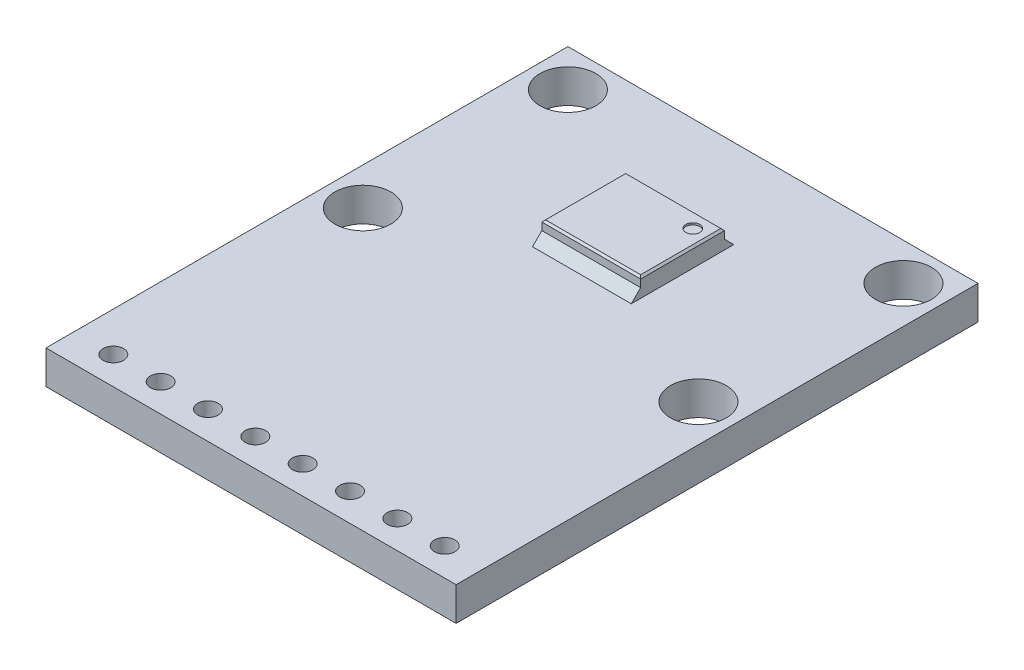
ISO-10303-21;
HEADER;
FILE_DESCRIPTION(('STEP AP214'),'2;1');
FILE_NAME('part.step','',(''),(''),'','','');
FILE_SCHEMA(('AUTOMOTIVE_DESIGN { 1 0 10303 214 1 1 1 1 }'));
ENDSEC;
DATA;
#1=APPLICATION_CONTEXT('core data for automotive mechanical design processes');
#2=APPLICATION_PROTOCOL_DEFINITION('international standard','automotive_design',2000,#1);
#3=PRODUCT_CONTEXT('',#1,'mechanical');
#4=PRODUCT('Part','Part','',(#3));
#5=PRODUCT_RELATED_PRODUCT_CATEGORY('part','',(#4));
#6=PRODUCT_DEFINITION_FORMATION('','',#4);
#7=PRODUCT_DEFINITION_CONTEXT('part definition',#1,'design');
#8=PRODUCT_DEFINITION('design','',#6,#7);
#9=PRODUCT_DEFINITION_SHAPE('','',#8);
#10=(LENGTH_UNIT() NAMED_UNIT(*) SI_UNIT(.MILLI.,.METRE.));
#11=(NAMED_UNIT(*) PLANE_ANGLE_UNIT() SI_UNIT($,.RADIAN.));
#12=(NAMED_UNIT(*) SI_UNIT($,.STERADIAN.) SOLID_ANGLE_UNIT());
#13=UNCERTAINTY_MEASURE_WITH_UNIT(LENGTH_MEASURE(1.E-05),#10,'distance_accuracy_value','');
#14=(GEOMETRIC_REPRESENTATION_CONTEXT(3) GLOBAL_UNCERTAINTY_ASSIGNED_CONTEXT((#13)) GLOBAL_UNIT_ASSIGNED_CONTEXT((#10,
#11,#12)) REPRESENTATION_CONTEXT('',''));
#15=CARTESIAN_POINT('',(0.,0.,0.));
#16=DIRECTION('',(0.,0.,1.));
#17=DIRECTION('',(1.,0.,0.));
#18=AXIS2_PLACEMENT_3D('',#15,#16,#17);
#19=CARTESIAN_POINT('',(0.,1.8,0.));
#20=DIRECTION('',(0.,1.,0.));
#21=DIRECTION('',(0.,0.,1.));
#22=AXIS2_PLACEMENT_3D('',#19,#20,#21);
#23=PLANE('',#22);
#24=CARTESIAN_POINT('',(6.35,1.8,12.5));
#25=DIRECTION('',(0.,1.,0.));
#26=DIRECTION('',(0.,0.,1.));
#27=AXIS2_PLACEMENT_3D('',#24,#25,#26);
#28=CIRCLE('',#27,0.55);
#29=CARTESIAN_POINT('',(6.35,1.8,13.05));
#30=VERTEX_POINT('',#29);
#31=EDGE_CURVE('E269',#30,#30,#28,.T.);
#32=ORIENTED_EDGE('',*,*,#31,.F.);
#33=EDGE_LOOP('',(#32));
#34=FACE_BOUND('',#33,.T.);
#35=CARTESIAN_POINT('',(1.27,1.8,12.5));
#36=DIRECTION('',(0.,1.,0.));
#37=DIRECTION('',(0.,0.,1.));
#38=AXIS2_PLACEMENT_3D('',#35,#36,#37);
#39=CIRCLE('',#38,0.55);
#40=CARTESIAN_POINT('',(1.27,1.8,13.05));
#41=VERTEX_POINT('',#40);
#42=EDGE_CURVE('E285',#41,#41,#39,.T.);
#43=ORIENTED_EDGE('',*,*,#42,.F.);
#44=EDGE_LOOP('',(#43));
#45=FACE_BOUND('',#44,.T.);
#46=CARTESIAN_POINT('',(-3.81,1.8,12.5));
#47=DIRECTION('',(0.,1.,0.));
#48=DIRECTION('',(0.,0.,1.));
#49=AXIS2_PLACEMENT_3D('',#46,#47,#48);
#50=CIRCLE('',#49,0.55);
#51=CARTESIAN_POINT('',(-3.81,1.8,13.05));
#52=VERTEX_POINT('',#51);
#53=EDGE_CURVE('E301',#52,#52,#50,.T.);
#54=ORIENTED_EDGE('',*,*,#53,.F.);
#55=EDGE_LOOP('',(#54));
#56=FACE_BOUND('',#55,.T.);
#57=CARTESIAN_POINT('',(-8.89,1.8,12.5));
#58=DIRECTION('',(0.,1.,0.));
#59=DIRECTION('',(0.,0.,1.));
#60=AXIS2_PLACEMENT_3D('',#57,#58,#59);
#61=CIRCLE('',#60,0.55);
#62=CARTESIAN_POINT('',(-8.89,1.8,13.05));
#63=VERTEX_POINT('',#62);
#64=EDGE_CURVE('E317',#63,#63,#61,.T.);
#65=ORIENTED_EDGE('',*,*,#64,.F.);
#66=EDGE_LOOP('',(#65));
#67=FACE_BOUND('',#66,.T.);
#68=CARTESIAN_POINT('',(9.,1.8,-1.));
#69=DIRECTION('',(0.,1.,0.));
#70=DIRECTION('',(0.,0.,1.));
#71=AXIS2_PLACEMENT_3D('',#68,#69,#70);
#72=CIRCLE('',#71,1.5);
#73=CARTESIAN_POINT('',(9.,1.8,0.5));
#74=VERTEX_POINT('',#73);
#75=EDGE_CURVE('E333',#74,#74,#72,.T.);
#76=ORIENTED_EDGE('',*,*,#75,.F.);
#77=EDGE_LOOP('',(#76));
#78=FACE_BOUND('',#77,.T.);
#79=CARTESIAN_POINT('',(-9.,1.8,-12.));
#80=DIRECTION('',(0.,1.,0.));
#81=DIRECTION('',(0.,0.,1.));
#82=AXIS2_PLACEMENT_3D('',#79,#80,#81);
#83=CIRCLE('',#82,1.5);
#84=CARTESIAN_POINT('',(-9.,1.8,-10.5));
#85=VERTEX_POINT('',#84);
#86=EDGE_CURVE('E349',#85,#85,#83,.T.);
#87=ORIENTED_EDGE('',*,*,#86,.F.);
#88=EDGE_LOOP('',(#87));
#89=FACE_BOUND('',#88,.T.);
#90=DIRECTION('',(0.,0.,-1.));
#91=VECTOR('',#90,1.);
#92=CARTESIAN_POINT('',(11.,1.8,-14.));
#93=LINE('',#92,#91);
#94=CARTESIAN_POINT('',(11.,1.8,14.));
#95=VERTEX_POINT('',#94);
#96=CARTESIAN_POINT('',(11.,1.8,-14.));
#97=VERTEX_POINT('',#96);
#98=EDGE_CURVE('E144',#95,#97,#93,.T.);
#99=ORIENTED_EDGE('',*,*,#98,.T.);
#100=DIRECTION('',(-1.,0.,0.));
#101=VECTOR('',#100,1.);
#102=CARTESIAN_POINT('',(-11.,1.8,-14.));
#103=LINE('',#102,#101);
#104=CARTESIAN_POINT('',(-11.,1.8,-14.));
#105=VERTEX_POINT('',#104);
#106=EDGE_CURVE('E132',#97,#105,#103,.T.);
#107=ORIENTED_EDGE('',*,*,#106,.T.);
#108=DIRECTION('',(0.,0.,1.));
#109=VECTOR('',#108,1.);
#110=CARTESIAN_POINT('',(-11.,1.8,-14.));
#111=LINE('',#110,#109);
#112=CARTESIAN_POINT('',(-11.,1.8,14.));
#113=VERTEX_POINT('',#112);
#114=EDGE_CURVE('E143',#105,#113,#111,.T.);
#115=ORIENTED_EDGE('',*,*,#114,.T.);
#116=DIRECTION('',(1.,0.,0.));
#117=VECTOR('',#116,1.);
#118=CARTESIAN_POINT('',(-11.,1.8,14.));
#119=LINE('',#118,#117);
#120=EDGE_CURVE('E149',#113,#95,#119,.T.);
#121=ORIENTED_EDGE('',*,*,#120,.T.);
#122=EDGE_LOOP('',(#99,#107,#115,#121));
#123=FACE_BOUND('',#122,.T.);
#124=CARTESIAN_POINT('',(9.,1.8,-12.));
#125=DIRECTION('',(0.,1.,0.));
#126=DIRECTION('',(0.,0.,1.));
#127=AXIS2_PLACEMENT_3D('',#124,#125,#126);
#128=CIRCLE('',#127,1.5);
#129=CARTESIAN_POINT('',(9.,1.8,-10.5));
#130=VERTEX_POINT('',#129);
#131=EDGE_CURVE('E341',#130,#130,#128,.T.);
#132=ORIENTED_EDGE('',*,*,#131,.F.);
#133=EDGE_LOOP('',(#132));
#134=FACE_BOUND('',#133,.T.);
#135=CARTESIAN_POINT('',(-9.,1.8,-1.));
#136=DIRECTION('',(0.,1.,0.));
#137=DIRECTION('',(0.,0.,1.));
#138=AXIS2_PLACEMENT_3D('',#135,#136,#137);
#139=CIRCLE('',#138,1.5);
#140=CARTESIAN_POINT('',(-9.,1.8,0.499999999999997));
#141=VERTEX_POINT('',#140);
#142=EDGE_CURVE('E325',#141,#141,#139,.T.);
#143=ORIENTED_EDGE('',*,*,#142,.F.);
#144=EDGE_LOOP('',(#143));
#145=FACE_BOUND('',#144,.T.);
#146=CARTESIAN_POINT('',(-6.35,1.8,12.5));
#147=DIRECTION('',(0.,1.,0.));
#148=DIRECTION('',(0.,0.,1.));
#149=AXIS2_PLACEMENT_3D('',#146,#147,#148);
#150=CIRCLE('',#149,0.55);
#151=CARTESIAN_POINT('',(-6.35,1.8,13.05));
#152=VERTEX_POINT('',#151);
#153=EDGE_CURVE('E309',#152,#152,#150,.T.);
#154=ORIENTED_EDGE('',*,*,#153,.F.);
#155=EDGE_LOOP('',(#154));
#156=FACE_BOUND('',#155,.T.);
#157=CARTESIAN_POINT('',(-1.27,1.8,12.5));
#158=DIRECTION('',(0.,1.,0.));
#159=DIRECTION('',(0.,0.,1.));
#160=AXIS2_PLACEMENT_3D('',#157,#158,#159);
#161=CIRCLE('',#160,0.55);
#162=CARTESIAN_POINT('',(-1.27,1.8,13.05));
#163=VERTEX_POINT('',#162);
#164=EDGE_CURVE('E293',#163,#163,#161,.T.);
#165=ORIENTED_EDGE('',*,*,#164,.F.);
#166=EDGE_LOOP('',(#165));
#167=FACE_BOUND('',#166,.T.);
#168=CARTESIAN_POINT('',(3.81,1.8,12.5));
#169=DIRECTION('',(0.,1.,0.));
#170=DIRECTION('',(0.,0.,1.));
#171=AXIS2_PLACEMENT_3D('',#168,#169,#170);
#172=CIRCLE('',#171,0.55);
#173=CARTESIAN_POINT('',(3.81,1.8,13.05));
#174=VERTEX_POINT('',#173);
#175=EDGE_CURVE('E277',#174,#174,#172,.T.);
#176=ORIENTED_EDGE('',*,*,#175,.F.);
#177=EDGE_LOOP('',(#176));
#178=FACE_BOUND('',#177,.T.);
#179=CARTESIAN_POINT('',(8.89,1.8,12.5));
#180=DIRECTION('',(0.,1.,0.));
#181=DIRECTION('',(0.,0.,1.));
#182=AXIS2_PLACEMENT_3D('',#179,#180,#181);
#183=CIRCLE('',#182,0.55);
#184=CARTESIAN_POINT('',(8.89,1.8,13.05));
#185=VERTEX_POINT('',#184);
#186=EDGE_CURVE('E261',#185,#185,#183,.T.);
#187=ORIENTED_EDGE('',*,*,#186,.F.);
#188=EDGE_LOOP('',(#187));
#189=FACE_BOUND('',#188,.T.);
#190=DIRECTION('',(0.,0.,1.));
#191=VECTOR('',#190,1.);
#192=CARTESIAN_POINT('',(-2.65,1.8,-8.75));
#193=LINE('',#192,#191);
#194=CARTESIAN_POINT('',(-2.65,1.8,-9.25));
#195=VERTEX_POINT('',#194);
#196=CARTESIAN_POINT('',(-2.65,1.8,-3.75));
#197=VERTEX_POINT('',#196);
#198=EDGE_CURVE('E239',#195,#197,#193,.T.);
#199=ORIENTED_EDGE('',*,*,#198,.F.);
#200=DIRECTION('',(1.,0.,0.));
#201=VECTOR('',#200,1.);
#202=CARTESIAN_POINT('',(0.,1.8,-9.25));
#203=LINE('',#202,#201);
#204=CARTESIAN_POINT('',(2.65,1.8,-9.25));
#205=VERTEX_POINT('',#204);
#206=EDGE_CURVE('E174',#195,#205,#203,.T.);
#207=ORIENTED_EDGE('',*,*,#206,.T.);
#208=DIRECTION('',(0.,0.,-1.));
#209=VECTOR('',#208,1.);
#210=CARTESIAN_POINT('',(2.65,1.8,-8.75));
#211=LINE('',#210,#209);
#212=CARTESIAN_POINT('',(2.65,1.8,-3.75));
#213=VERTEX_POINT('',#212);
#214=EDGE_CURVE('E234',#213,#205,#211,.T.);
#215=ORIENTED_EDGE('',*,*,#214,.F.);
#216=DIRECTION('',(-1.,0.,0.));
#217=VECTOR('',#216,1.);
#218=CARTESIAN_POINT('',(0.,1.8,-3.75));
#219=LINE('',#218,#217);
#220=EDGE_CURVE('E165',#213,#197,#219,.T.);
#221=ORIENTED_EDGE('',*,*,#220,.T.);
#222=EDGE_LOOP('',(#199,#207,#215,#221));
#223=FACE_BOUND('',#222,.T.);
#224=ADVANCED_FACE('F40',(#34,#45,#56,#67,#78,#89,#123,#134,#145,#156,#167,#178,#189,#223),#23,.T.);
#225=CARTESIAN_POINT('',(0.,0.,0.));
#226=DIRECTION('',(0.,1.,0.));
#227=DIRECTION('',(0.,0.,1.));
#228=AXIS2_PLACEMENT_3D('',#225,#226,#227);
#229=PLANE('',#228);
#230=DIRECTION('',(0.,0.,-1.));
#231=VECTOR('',#230,1.);
#232=CARTESIAN_POINT('',(11.,0.,-14.));
#233=LINE('',#232,#231);
#234=CARTESIAN_POINT('',(11.,0.,14.));
#235=VERTEX_POINT('',#234);
#236=CARTESIAN_POINT('',(11.,0.,-14.));
#237=VERTEX_POINT('',#236);
#238=EDGE_CURVE('E158',#235,#237,#233,.T.);
#239=ORIENTED_EDGE('',*,*,#238,.F.);
#240=DIRECTION('',(1.,0.,0.));
#241=VECTOR('',#240,1.);
#242=CARTESIAN_POINT('',(-11.,0.,14.));
#243=LINE('',#242,#241);
#244=CARTESIAN_POINT('',(-11.,0.,14.));
#245=VERTEX_POINT('',#244);
#246=EDGE_CURVE('E154',#245,#235,#243,.T.);
#247=ORIENTED_EDGE('',*,*,#246,.F.);
#248=DIRECTION('',(0.,0.,1.));
#249=VECTOR('',#248,1.);
#250=CARTESIAN_POINT('',(-11.,0.,-14.));
#251=LINE('',#250,#249);
#252=CARTESIAN_POINT('',(-11.,0.,-14.));
#253=VERTEX_POINT('',#252);
#254=EDGE_CURVE('E366',#253,#245,#251,.T.);
#255=ORIENTED_EDGE('',*,*,#254,.F.);
#256=DIRECTION('',(-1.,0.,0.));
#257=VECTOR('',#256,1.);
#258=CARTESIAN_POINT('',(-11.,0.,-14.));
#259=LINE('',#258,#257);
#260=EDGE_CURVE('E363',#237,#253,#259,.T.);
#261=ORIENTED_EDGE('',*,*,#260,.F.);
#262=EDGE_LOOP('',(#239,#247,#255,#261));
#263=FACE_BOUND('',#262,.T.);
#264=CARTESIAN_POINT('',(-9.,0.,-12.));
#265=DIRECTION('',(0.,1.,0.));
#266=DIRECTION('',(0.,0.,1.));
#267=AXIS2_PLACEMENT_3D('',#264,#265,#266);
#268=CIRCLE('',#267,1.5);
#269=CARTESIAN_POINT('',(-9.,0.,-10.5));
#270=VERTEX_POINT('',#269);
#271=EDGE_CURVE('E345',#270,#270,#268,.T.);
#272=ORIENTED_EDGE('',*,*,#271,.T.);
#273=EDGE_LOOP('',(#272));
#274=FACE_BOUND('',#273,.T.);
#275=CARTESIAN_POINT('',(9.,0.,-12.));
#276=DIRECTION('',(0.,1.,0.));
#277=DIRECTION('',(0.,0.,1.));
#278=AXIS2_PLACEMENT_3D('',#275,#276,#277);
#279=CIRCLE('',#278,1.5);
#280=CARTESIAN_POINT('',(9.,0.,-10.5));
#281=VERTEX_POINT('',#280);
#282=EDGE_CURVE('E337',#281,#281,#279,.T.);
#283=ORIENTED_EDGE('',*,*,#282,.T.);
#284=EDGE_LOOP('',(#283));
#285=FACE_BOUND('',#284,.T.);
#286=CARTESIAN_POINT('',(9.,0.,-1.));
#287=DIRECTION('',(0.,1.,0.));
#288=DIRECTION('',(0.,0.,1.));
#289=AXIS2_PLACEMENT_3D('',#286,#287,#288);
#290=CIRCLE('',#289,1.5);
#291=CARTESIAN_POINT('',(9.,0.,0.5));
#292=VERTEX_POINT('',#291);
#293=EDGE_CURVE('E329',#292,#292,#290,.T.);
#294=ORIENTED_EDGE('',*,*,#293,.T.);
#295=EDGE_LOOP('',(#294));
#296=FACE_BOUND('',#295,.T.);
#297=CARTESIAN_POINT('',(-9.,0.,-1.));
#298=DIRECTION('',(0.,1.,0.));
#299=DIRECTION('',(0.,0.,1.));
#300=AXIS2_PLACEMENT_3D('',#297,#298,#299);
#301=CIRCLE('',#300,1.5);
#302=CARTESIAN_POINT('',(-9.,0.,0.499999999999997));
#303=VERTEX_POINT('',#302);
#304=EDGE_CURVE('E321',#303,#303,#301,.T.);
#305=ORIENTED_EDGE('',*,*,#304,.T.);
#306=EDGE_LOOP('',(#305));
#307=FACE_BOUND('',#306,.T.);
#308=CARTESIAN_POINT('',(-8.89,0.,12.5));
#309=DIRECTION('',(0.,1.,0.));
#310=DIRECTION('',(0.,0.,1.));
#311=AXIS2_PLACEMENT_3D('',#308,#309,#310);
#312=CIRCLE('',#311,0.55);
#313=CARTESIAN_POINT('',(-8.89,0.,13.05));
#314=VERTEX_POINT('',#313);
#315=EDGE_CURVE('E313',#314,#314,#312,.T.);
#316=ORIENTED_EDGE('',*,*,#315,.T.);
#317=EDGE_LOOP('',(#316));
#318=FACE_BOUND('',#317,.T.);
#319=CARTESIAN_POINT('',(-6.35,0.,12.5));
#320=DIRECTION('',(0.,1.,0.));
#321=DIRECTION('',(0.,0.,1.));
#322=AXIS2_PLACEMENT_3D('',#319,#320,#321);
#323=CIRCLE('',#322,0.55);
#324=CARTESIAN_POINT('',(-6.35,0.,13.05));
#325=VERTEX_POINT('',#324);
#326=EDGE_CURVE('E305',#325,#325,#323,.T.);
#327=ORIENTED_EDGE('',*,*,#326,.T.);
#328=EDGE_LOOP('',(#327));
#329=FACE_BOUND('',#328,.T.);
#330=CARTESIAN_POINT('',(-3.81,0.,12.5));
#331=DIRECTION('',(0.,1.,0.));
#332=DIRECTION('',(0.,0.,1.));
#333=AXIS2_PLACEMENT_3D('',#330,#331,#332);
#334=CIRCLE('',#333,0.55);
#335=CARTESIAN_POINT('',(-3.81,0.,13.05));
#336=VERTEX_POINT('',#335);
#337=EDGE_CURVE('E297',#336,#336,#334,.T.);
#338=ORIENTED_EDGE('',*,*,#337,.T.);
#339=EDGE_LOOP('',(#338));
#340=FACE_BOUND('',#339,.T.);
#341=CARTESIAN_POINT('',(-1.27,0.,12.5));
#342=DIRECTION('',(0.,1.,0.));
#343=DIRECTION('',(0.,0.,1.));
#344=AXIS2_PLACEMENT_3D('',#341,#342,#343);
#345=CIRCLE('',#344,0.55);
#346=CARTESIAN_POINT('',(-1.27,0.,13.05));
#347=VERTEX_POINT('',#346);
#348=EDGE_CURVE('E289',#347,#347,#345,.T.);
#349=ORIENTED_EDGE('',*,*,#348,.T.);
#350=EDGE_LOOP('',(#349));
#351=FACE_BOUND('',#350,.T.);
#352=CARTESIAN_POINT('',(1.27,0.,12.5));
#353=DIRECTION('',(0.,1.,0.));
#354=DIRECTION('',(0.,0.,1.));
#355=AXIS2_PLACEMENT_3D('',#352,#353,#354);
#356=CIRCLE('',#355,0.55);
#357=CARTESIAN_POINT('',(1.27,0.,13.05));
#358=VERTEX_POINT('',#357);
#359=EDGE_CURVE('E281',#358,#358,#356,.T.);
#360=ORIENTED_EDGE('',*,*,#359,.T.);
#361=EDGE_LOOP('',(#360));
#362=FACE_BOUND('',#361,.T.);
#363=CARTESIAN_POINT('',(3.81,0.,12.5));
#364=DIRECTION('',(0.,1.,0.));
#365=DIRECTION('',(0.,0.,1.));
#366=AXIS2_PLACEMENT_3D('',#363,#364,#365);
#367=CIRCLE('',#366,0.55);
#368=CARTESIAN_POINT('',(3.81,0.,13.05));
#369=VERTEX_POINT('',#368);
#370=EDGE_CURVE('E273',#369,#369,#367,.T.);
#371=ORIENTED_EDGE('',*,*,#370,.T.);
#372=EDGE_LOOP('',(#371));
#373=FACE_BOUND('',#372,.T.);
#374=CARTESIAN_POINT('',(6.35,0.,12.5));
#375=DIRECTION('',(0.,1.,0.));
#376=DIRECTION('',(0.,0.,1.));
#377=AXIS2_PLACEMENT_3D('',#374,#375,#376);
#378=CIRCLE('',#377,0.55);
#379=CARTESIAN_POINT('',(6.35,0.,13.05));
#380=VERTEX_POINT('',#379);
#381=EDGE_CURVE('E265',#380,#380,#378,.T.);
#382=ORIENTED_EDGE('',*,*,#381,.T.);
#383=EDGE_LOOP('',(#382));
#384=FACE_BOUND('',#383,.T.);
#385=CARTESIAN_POINT('',(8.89,0.,12.5));
#386=DIRECTION('',(0.,1.,0.));
#387=DIRECTION('',(0.,0.,1.));
#388=AXIS2_PLACEMENT_3D('',#385,#386,#387);
#389=CIRCLE('',#388,0.55);
#390=CARTESIAN_POINT('',(8.89,0.,13.05));
#391=VERTEX_POINT('',#390);
#392=EDGE_CURVE('E260',#391,#391,#389,.T.);
#393=ORIENTED_EDGE('',*,*,#392,.T.);
#394=EDGE_LOOP('',(#393));
#395=FACE_BOUND('',#394,.T.);
#396=ADVANCED_FACE('F381',(#263,#274,#285,#296,#307,#318,#329,#340,#351,#362,#373,#384,#395),
#229,.F.);
#397=CARTESIAN_POINT('',(11.,1.8,-14.));
#398=DIRECTION('',(-1.,0.,0.));
#399=DIRECTION('',(0.,0.,1.));
#400=AXIS2_PLACEMENT_3D('',#397,#398,#399);
#401=PLANE('',#400);
#402=ORIENTED_EDGE('',*,*,#238,.T.);
#403=DIRECTION('',(0.,-1.,0.));
#404=VECTOR('',#403,1.);
#405=CARTESIAN_POINT('',(11.,1.8,-14.));
#406=LINE('',#405,#404);
#407=EDGE_CURVE('E136',#97,#237,#406,.T.);
#408=ORIENTED_EDGE('',*,*,#407,.F.);
#409=ORIENTED_EDGE('',*,*,#98,.F.);
#410=DIRECTION('',(0.,-1.,0.));
#411=VECTOR('',#410,1.);
#412=CARTESIAN_POINT('',(11.,1.8,14.));
#413=LINE('',#412,#411);
#414=EDGE_CURVE('E360',#95,#235,#413,.T.);
#415=ORIENTED_EDGE('',*,*,#414,.T.);
#416=EDGE_LOOP('',(#402,#408,#409,#415));
#417=FACE_BOUND('',#416,.T.);
#418=ADVANCED_FACE('F156',(#417),#401,.F.);
#419=CARTESIAN_POINT('',(-11.,1.8,-14.));
#420=DIRECTION('',(0.,0.,1.));
#421=DIRECTION('',(1.,0.,0.));
#422=AXIS2_PLACEMENT_3D('',#419,#420,#421);
#423=PLANE('',#422);
#424=ORIENTED_EDGE('',*,*,#260,.T.);
#425=DIRECTION('',(0.,-1.,0.));
#426=VECTOR('',#425,1.);
#427=CARTESIAN_POINT('',(-11.,1.8,-14.));
#428=LINE('',#427,#426);
#429=EDGE_CURVE('E139',#105,#253,#428,.T.);
#430=ORIENTED_EDGE('',*,*,#429,.F.);
#431=ORIENTED_EDGE('',*,*,#106,.F.);
#432=ORIENTED_EDGE('',*,*,#407,.T.);
#433=EDGE_LOOP('',(#424,#430,#431,#432));
#434=FACE_BOUND('',#433,.T.);
#435=ADVANCED_FACE('F134',(#434),#423,.F.);
#436=CARTESIAN_POINT('',(-11.,1.8,-14.));
#437=DIRECTION('',(1.,0.,0.));
#438=DIRECTION('',(0.,0.,-1.));
#439=AXIS2_PLACEMENT_3D('',#436,#437,#438);
#440=PLANE('',#439);
#441=ORIENTED_EDGE('',*,*,#254,.T.);
#442=DIRECTION('',(0.,-1.,0.));
#443=VECTOR('',#442,1.);
#444=CARTESIAN_POINT('',(-11.,1.8,14.));
#445=LINE('',#444,#443);
#446=EDGE_CURVE('E167',#113,#245,#445,.T.);
#447=ORIENTED_EDGE('',*,*,#446,.F.);
#448=ORIENTED_EDGE('',*,*,#114,.F.);
#449=ORIENTED_EDGE('',*,*,#429,.T.);
#450=EDGE_LOOP('',(#441,#447,#448,#449));
#451=FACE_BOUND('',#450,.T.);
#452=ADVANCED_FACE('F383',(#451),#440,.F.);
#453=CARTESIAN_POINT('',(-11.,1.8,14.));
#454=DIRECTION('',(0.,0.,-1.));
#455=DIRECTION('',(-1.,0.,0.));
#456=AXIS2_PLACEMENT_3D('',#453,#454,#455);
#457=PLANE('',#456);
#458=ORIENTED_EDGE('',*,*,#246,.T.);
#459=ORIENTED_EDGE('',*,*,#414,.F.);
#460=ORIENTED_EDGE('',*,*,#120,.F.);
#461=ORIENTED_EDGE('',*,*,#446,.T.);
#462=EDGE_LOOP('',(#458,#459,#460,#461));
#463=FACE_BOUND('',#462,.T.);
#464=ADVANCED_FACE('F377',(#463),#457,.F.);
#465=CARTESIAN_POINT('',(-9.,1.8,-12.));
#466=DIRECTION('',(0.,-1.,0.));
#467=DIRECTION('',(0.,0.,-1.));
#468=AXIS2_PLACEMENT_3D('',#465,#466,#467);
#469=CYLINDRICAL_SURFACE('',#468,1.5);
#470=ORIENTED_EDGE('',*,*,#86,.T.);
#471=EDGE_LOOP('',(#470));
#472=FACE_BOUND('',#471,.T.);
#473=ORIENTED_EDGE('',*,*,#271,.F.);
#474=EDGE_LOOP('',(#473));
#475=FACE_BOUND('',#474,.T.);
#476=ADVANCED_FACE('F390',(#472,#475),#469,.F.);
#477=CARTESIAN_POINT('',(9.,1.8,-12.));
#478=DIRECTION('',(0.,-1.,0.));
#479=DIRECTION('',(0.,0.,-1.));
#480=AXIS2_PLACEMENT_3D('',#477,#478,#479);
#481=CYLINDRICAL_SURFACE('',#480,1.5);
#482=ORIENTED_EDGE('',*,*,#131,.T.);
#483=EDGE_LOOP('',(#482));
#484=FACE_BOUND('',#483,.T.);
#485=ORIENTED_EDGE('',*,*,#282,.F.);
#486=EDGE_LOOP('',(#485));
#487=FACE_BOUND('',#486,.T.);
#488=ADVANCED_FACE('F407',(#484,#487),#481,.F.);
#489=CARTESIAN_POINT('',(9.,1.8,-1.));
#490=DIRECTION('',(0.,-1.,0.));
#491=DIRECTION('',(0.,0.,-1.));
#492=AXIS2_PLACEMENT_3D('',#489,#490,#491);
#493=CYLINDRICAL_SURFACE('',#492,1.5);
#494=ORIENTED_EDGE('',*,*,#75,.T.);
#495=EDGE_LOOP('',(#494));
#496=FACE_BOUND('',#495,.T.);
#497=ORIENTED_EDGE('',*,*,#293,.F.);
#498=EDGE_LOOP('',(#497));
#499=FACE_BOUND('',#498,.T.);
#500=ADVANCED_FACE('F411',(#496,#499),#493,.F.);
#501=CARTESIAN_POINT('',(-9.,1.8,-1.));
#502=DIRECTION('',(0.,-1.,0.));
#503=DIRECTION('',(0.,0.,-1.));
#504=AXIS2_PLACEMENT_3D('',#501,#502,#503);
#505=CYLINDRICAL_SURFACE('',#504,1.5);
#506=ORIENTED_EDGE('',*,*,#142,.T.);
#507=EDGE_LOOP('',(#506));
#508=FACE_BOUND('',#507,.T.);
#509=ORIENTED_EDGE('',*,*,#304,.F.);
#510=EDGE_LOOP('',(#509));
#511=FACE_BOUND('',#510,.T.);
#512=ADVANCED_FACE('F415',(#508,#511),#505,.F.);
#513=CARTESIAN_POINT('',(-8.89,1.8,12.5));
#514=DIRECTION('',(0.,-1.,0.));
#515=DIRECTION('',(0.,0.,-1.));
#516=AXIS2_PLACEMENT_3D('',#513,#514,#515);
#517=CYLINDRICAL_SURFACE('',#516,0.55);
#518=ORIENTED_EDGE('',*,*,#64,.T.);
#519=EDGE_LOOP('',(#518));
#520=FACE_BOUND('',#519,.T.);
#521=ORIENTED_EDGE('',*,*,#315,.F.);
#522=EDGE_LOOP('',(#521));
#523=FACE_BOUND('',#522,.T.);
#524=ADVANCED_FACE('F419',(#520,#523),#517,.F.);
#525=CARTESIAN_POINT('',(-6.35,1.8,12.5));
#526=DIRECTION('',(0.,-1.,0.));
#527=DIRECTION('',(0.,0.,-1.));
#528=AXIS2_PLACEMENT_3D('',#525,#526,#527);
#529=CYLINDRICAL_SURFACE('',#528,0.55);
#530=ORIENTED_EDGE('',*,*,#153,.T.);
#531=EDGE_LOOP('',(#530));
#532=FACE_BOUND('',#531,.T.);
#533=ORIENTED_EDGE('',*,*,#326,.F.);
#534=EDGE_LOOP('',(#533));
#535=FACE_BOUND('',#534,.T.);
#536=ADVANCED_FACE('F423',(#532,#535),#529,.F.);
#537=CARTESIAN_POINT('',(-3.81,1.8,12.5));
#538=DIRECTION('',(0.,-1.,0.));
#539=DIRECTION('',(0.,0.,-1.));
#540=AXIS2_PLACEMENT_3D('',#537,#538,#539);
#541=CYLINDRICAL_SURFACE('',#540,0.55);
#542=ORIENTED_EDGE('',*,*,#53,.T.);
#543=EDGE_LOOP('',(#542));
#544=FACE_BOUND('',#543,.T.);
#545=ORIENTED_EDGE('',*,*,#337,.F.);
#546=EDGE_LOOP('',(#545));
#547=FACE_BOUND('',#546,.T.);
#548=ADVANCED_FACE('F427',(#544,#547),#541,.F.);
#549=CARTESIAN_POINT('',(-1.27,1.8,12.5));
#550=DIRECTION('',(0.,-1.,0.));
#551=DIRECTION('',(0.,0.,-1.));
#552=AXIS2_PLACEMENT_3D('',#549,#550,#551);
#553=CYLINDRICAL_SURFACE('',#552,0.55);
#554=ORIENTED_EDGE('',*,*,#164,.T.);
#555=EDGE_LOOP('',(#554));
#556=FACE_BOUND('',#555,.T.);
#557=ORIENTED_EDGE('',*,*,#348,.F.);
#558=EDGE_LOOP('',(#557));
#559=FACE_BOUND('',#558,.T.);
#560=ADVANCED_FACE('F431',(#556,#559),#553,.F.);
#561=CARTESIAN_POINT('',(1.27,1.8,12.5));
#562=DIRECTION('',(0.,-1.,0.));
#563=DIRECTION('',(0.,0.,-1.));
#564=AXIS2_PLACEMENT_3D('',#561,#562,#563);
#565=CYLINDRICAL_SURFACE('',#564,0.55);
#566=ORIENTED_EDGE('',*,*,#42,.T.);
#567=EDGE_LOOP('',(#566));
#568=FACE_BOUND('',#567,.T.);
#569=ORIENTED_EDGE('',*,*,#359,.F.);
#570=EDGE_LOOP('',(#569));
#571=FACE_BOUND('',#570,.T.);
#572=ADVANCED_FACE('F435',(#568,#571),#565,.F.);
#573=CARTESIAN_POINT('',(3.81,1.8,12.5));
#574=DIRECTION('',(0.,-1.,0.));
#575=DIRECTION('',(0.,0.,-1.));
#576=AXIS2_PLACEMENT_3D('',#573,#574,#575);
#577=CYLINDRICAL_SURFACE('',#576,0.55);
#578=ORIENTED_EDGE('',*,*,#175,.T.);
#579=EDGE_LOOP('',(#578));
#580=FACE_BOUND('',#579,.T.);
#581=ORIENTED_EDGE('',*,*,#370,.F.);
#582=EDGE_LOOP('',(#581));
#583=FACE_BOUND('',#582,.T.);
#584=ADVANCED_FACE('F439',(#580,#583),#577,.F.);
#585=CARTESIAN_POINT('',(6.35,1.8,12.5));
#586=DIRECTION('',(0.,-1.,0.));
#587=DIRECTION('',(0.,0.,-1.));
#588=AXIS2_PLACEMENT_3D('',#585,#586,#587);
#589=CYLINDRICAL_SURFACE('',#588,0.55);
#590=ORIENTED_EDGE('',*,*,#31,.T.);
#591=EDGE_LOOP('',(#590));
#592=FACE_BOUND('',#591,.T.);
#593=ORIENTED_EDGE('',*,*,#381,.F.);
#594=EDGE_LOOP('',(#593));
#595=FACE_BOUND('',#594,.T.);
#596=ADVANCED_FACE('F443',(#592,#595),#589,.F.);
#597=CARTESIAN_POINT('',(8.89,1.8,12.5));
#598=DIRECTION('',(0.,-1.,0.));
#599=DIRECTION('',(0.,0.,-1.));
#600=AXIS2_PLACEMENT_3D('',#597,#598,#599);
#601=CYLINDRICAL_SURFACE('',#600,0.55);
#602=ORIENTED_EDGE('',*,*,#186,.T.);
#603=EDGE_LOOP('',(#602));
#604=FACE_BOUND('',#603,.T.);
#605=ORIENTED_EDGE('',*,*,#392,.F.);
#606=EDGE_LOOP('',(#605));
#607=FACE_BOUND('',#606,.T.);
#608=ADVANCED_FACE('F447',(#604,#607),#601,.F.);
#609=CARTESIAN_POINT('',(2.65,2.8,-8.75));
#610=DIRECTION('',(-1.,0.,0.));
#611=DIRECTION('',(0.,0.,1.));
#612=AXIS2_PLACEMENT_3D('',#609,#610,#611);
#613=PLANE('',#612);
#614=DIRECTION('',(0.,-1.,0.));
#615=VECTOR('',#614,1.);
#616=CARTESIAN_POINT('',(2.65,2.8,-8.75));
#617=LINE('',#616,#615);
#618=CARTESIAN_POINT('',(2.65,2.7,-8.75));
#619=VERTEX_POINT('',#618);
#620=CARTESIAN_POINT('',(2.65,2.3,-8.75));
#621=VERTEX_POINT('',#620);
#622=EDGE_CURVE('E257',#619,#621,#617,.T.);
#623=ORIENTED_EDGE('',*,*,#622,.F.);
#624=DIRECTION('',(0.,0.,1.));
#625=VECTOR('',#624,1.);
#626=CARTESIAN_POINT('',(2.65,2.7,-4.25));
#627=LINE('',#626,#625);
#628=CARTESIAN_POINT('',(2.65,2.7,-4.25));
#629=VERTEX_POINT('',#628);
#630=EDGE_CURVE('E11',#619,#629,#627,.T.);
#631=ORIENTED_EDGE('',*,*,#630,.T.);
#632=DIRECTION('',(0.,-1.,0.));
#633=VECTOR('',#632,1.);
#634=CARTESIAN_POINT('',(2.65,2.8,-4.25));
#635=LINE('',#634,#633);
#636=CARTESIAN_POINT('',(2.65,2.30000000000001,-4.25));
#637=VERTEX_POINT('',#636);
#638=EDGE_CURVE('E243',#629,#637,#635,.T.);
#639=ORIENTED_EDGE('',*,*,#638,.T.);
#640=DIRECTION('',(0.,-0.707106781186552,0.707106781186543));
#641=VECTOR('',#640,1.);
#642=CARTESIAN_POINT('',(2.65,4.80000000000001,-6.74999999999997));
#643=LINE('',#642,#641);
#644=EDGE_CURVE('E190',#637,#213,#643,.T.);
#645=ORIENTED_EDGE('',*,*,#644,.T.);
#646=ORIENTED_EDGE('',*,*,#214,.T.);
#647=DIRECTION('',(0.,0.707106781186552,0.707106781186543));
#648=VECTOR('',#647,1.);
#649=CARTESIAN_POINT('',(2.65,2.55,-8.5));
#650=LINE('',#649,#648);
#651=EDGE_CURVE('E186',#205,#621,#650,.T.);
#652=ORIENTED_EDGE('',*,*,#651,.T.);
#653=EDGE_LOOP('',(#623,#631,#639,#645,#646,#652));
#654=FACE_BOUND('',#653,.T.);
#655=ADVANCED_FACE('F451',(#654),#613,.F.);
#656=CARTESIAN_POINT('',(-2.65,2.8,-8.75));
#657=DIRECTION('',(0.,0.,1.));
#658=DIRECTION('',(1.,0.,0.));
#659=AXIS2_PLACEMENT_3D('',#656,#657,#658);
#660=PLANE('',#659);
#661=DIRECTION('',(0.,-1.,0.));
#662=VECTOR('',#661,1.);
#663=CARTESIAN_POINT('',(-2.65,2.8,-8.75));
#664=LINE('',#663,#662);
#665=CARTESIAN_POINT('',(-2.65,2.7,-8.75));
#666=VERTEX_POINT('',#665);
#667=CARTESIAN_POINT('',(-2.65,2.3,-8.75));
#668=VERTEX_POINT('',#667);
#669=EDGE_CURVE('E254',#666,#668,#664,.T.);
#670=ORIENTED_EDGE('',*,*,#669,.F.);
#671=DIRECTION('',(1.,0.,0.));
#672=VECTOR('',#671,1.);
#673=CARTESIAN_POINT('',(2.65,2.7,-8.75));
#674=LINE('',#673,#672);
#675=EDGE_CURVE('E51',#666,#619,#674,.T.);
#676=ORIENTED_EDGE('',*,*,#675,.T.);
#677=ORIENTED_EDGE('',*,*,#622,.T.);
#678=DIRECTION('',(-1.,0.,0.));
#679=VECTOR('',#678,1.);
#680=CARTESIAN_POINT('',(-2.65,2.3,-8.75));
#681=LINE('',#680,#679);
#682=EDGE_CURVE('E160',#621,#668,#681,.T.);
#683=ORIENTED_EDGE('',*,*,#682,.T.);
#684=EDGE_LOOP('',(#670,#676,#677,#683));
#685=FACE_BOUND('',#684,.T.);
#686=ADVANCED_FACE('F455',(#685),#660,.F.);
#687=CARTESIAN_POINT('',(-2.65,2.8,-8.75));
#688=DIRECTION('',(1.,0.,0.));
#689=DIRECTION('',(0.,0.,-1.));
#690=AXIS2_PLACEMENT_3D('',#687,#688,#689);
#691=PLANE('',#690);
#692=DIRECTION('',(0.,-1.,0.));
#693=VECTOR('',#692,1.);
#694=CARTESIAN_POINT('',(-2.65,2.8,-4.25));
#695=LINE('',#694,#693);
#696=CARTESIAN_POINT('',(-2.65,2.7,-4.25));
#697=VERTEX_POINT('',#696);
#698=CARTESIAN_POINT('',(-2.65,2.30000000000001,-4.25));
#699=VERTEX_POINT('',#698);
#700=EDGE_CURVE('E251',#697,#699,#695,.T.);
#701=ORIENTED_EDGE('',*,*,#700,.F.);
#702=DIRECTION('',(0.,0.,-1.));
#703=VECTOR('',#702,1.);
#704=CARTESIAN_POINT('',(-2.65,2.7,-8.75));
#705=LINE('',#704,#703);
#706=EDGE_CURVE('E66',#697,#666,#705,.T.);
#707=ORIENTED_EDGE('',*,*,#706,.T.);
#708=ORIENTED_EDGE('',*,*,#669,.T.);
#709=DIRECTION('',(0.,-0.707106781186552,-0.707106781186543));
#710=VECTOR('',#709,1.);
#711=CARTESIAN_POINT('',(-2.65,2.55,-8.5));
#712=LINE('',#711,#710);
#713=EDGE_CURVE('E182',#668,#195,#712,.T.);
#714=ORIENTED_EDGE('',*,*,#713,.T.);
#715=ORIENTED_EDGE('',*,*,#198,.T.);
#716=DIRECTION('',(0.,0.707106781186552,-0.707106781186543));
#717=VECTOR('',#716,1.);
#718=CARTESIAN_POINT('',(-2.65,4.80000000000001,-6.74999999999997));
#719=LINE('',#718,#717);
#720=EDGE_CURVE('E194',#197,#699,#719,.T.);
#721=ORIENTED_EDGE('',*,*,#720,.T.);
#722=EDGE_LOOP('',(#701,#707,#708,#714,#715,#721));
#723=FACE_BOUND('',#722,.T.);
#724=ADVANCED_FACE('F458',(#723),#691,.F.);
#725=CARTESIAN_POINT('',(-2.65,2.8,-4.25));
#726=DIRECTION('',(0.,0.,-1.));
#727=DIRECTION('',(-1.,0.,0.));
#728=AXIS2_PLACEMENT_3D('',#725,#726,#727);
#729=PLANE('',#728);
#730=ORIENTED_EDGE('',*,*,#638,.F.);
#731=DIRECTION('',(-1.,0.,0.));
#732=VECTOR('',#731,1.);
#733=CARTESIAN_POINT('',(-2.65,2.7,-4.25));
#734=LINE('',#733,#732);
#735=EDGE_CURVE('E211',#629,#697,#734,.T.);
#736=ORIENTED_EDGE('',*,*,#735,.T.);
#737=ORIENTED_EDGE('',*,*,#700,.T.);
#738=DIRECTION('',(1.,0.,0.));
#739=VECTOR('',#738,1.);
#740=CARTESIAN_POINT('',(-2.65,2.30000000000001,-4.25));
#741=LINE('',#740,#739);
#742=EDGE_CURVE('E178',#699,#637,#741,.T.);
#743=ORIENTED_EDGE('',*,*,#742,.T.);
#744=EDGE_LOOP('',(#730,#736,#737,#743));
#745=FACE_BOUND('',#744,.T.);
#746=ADVANCED_FACE('F461',(#745),#729,.F.);
#747=CARTESIAN_POINT('',(0.,2.8,0.));
#748=DIRECTION('',(0.,1.,0.));
#749=DIRECTION('',(0.,0.,1.));
#750=AXIS2_PLACEMENT_3D('',#747,#748,#749);
#751=PLANE('',#750);
#752=CARTESIAN_POINT('',(1.8,2.8,-7.9));
#753=DIRECTION('',(0.,1.,0.));
#754=DIRECTION('',(0.,0.,1.));
#755=AXIS2_PLACEMENT_3D('',#752,#753,#754);
#756=CIRCLE('',#755,0.375);
#757=CARTESIAN_POINT('',(1.8,2.8,-7.525));
#758=VERTEX_POINT('',#757);
#759=EDGE_CURVE('E246',#758,#758,#756,.T.);
#760=ORIENTED_EDGE('',*,*,#759,.F.);
#761=EDGE_LOOP('',(#760));
#762=FACE_BOUND('',#761,.T.);
#763=DIRECTION('',(0.,0.,1.));
#764=VECTOR('',#763,1.);
#765=CARTESIAN_POINT('',(-2.55,2.8,-4.25));
#766=LINE('',#765,#764);
#767=CARTESIAN_POINT('',(-2.55,2.8,-8.65000000000001));
#768=VERTEX_POINT('',#767);
#769=CARTESIAN_POINT('',(-2.55,2.8,-4.35));
#770=VERTEX_POINT('',#769);
#771=EDGE_CURVE('E204',#768,#770,#766,.T.);
#772=ORIENTED_EDGE('',*,*,#771,.T.);
#773=DIRECTION('',(1.,0.,0.));
#774=VECTOR('',#773,1.);
#775=CARTESIAN_POINT('',(2.65,2.8,-4.35));
#776=LINE('',#775,#774);
#777=CARTESIAN_POINT('',(2.55,2.8,-4.35));
#778=VERTEX_POINT('',#777);
#779=EDGE_CURVE('E207',#770,#778,#776,.T.);
#780=ORIENTED_EDGE('',*,*,#779,.T.);
#781=DIRECTION('',(0.,0.,-1.));
#782=VECTOR('',#781,1.);
#783=CARTESIAN_POINT('',(2.55,2.8,-8.75));
#784=LINE('',#783,#782);
#785=CARTESIAN_POINT('',(2.55,2.8,-8.65000000000001));
#786=VERTEX_POINT('',#785);
#787=EDGE_CURVE('E198',#778,#786,#784,.T.);
#788=ORIENTED_EDGE('',*,*,#787,.T.);
#789=DIRECTION('',(-1.,0.,0.));
#790=VECTOR('',#789,1.);
#791=CARTESIAN_POINT('',(-2.65,2.8,-8.65000000000001));
#792=LINE('',#791,#790);
#793=EDGE_CURVE('E201',#786,#768,#792,.T.);
#794=ORIENTED_EDGE('',*,*,#793,.T.);
#795=EDGE_LOOP('',(#772,#780,#788,#794));
#796=FACE_BOUND('',#795,.T.);
#797=ADVANCED_FACE('F464',(#762,#796),#751,.T.);
#798=CARTESIAN_POINT('',(-2.65,2.3,-8.75));
#799=DIRECTION('',(0.,-0.707106781186543,0.707106781186552));
#800=DIRECTION('',(-1.,0.,0.));
#801=AXIS2_PLACEMENT_3D('',#798,#799,#800);
#802=PLANE('',#801);
#803=ORIENTED_EDGE('',*,*,#651,.F.);
#804=ORIENTED_EDGE('',*,*,#206,.F.);
#805=ORIENTED_EDGE('',*,*,#713,.F.);
#806=ORIENTED_EDGE('',*,*,#682,.F.);
#807=EDGE_LOOP('',(#803,#804,#805,#806));
#808=FACE_BOUND('',#807,.T.);
#809=ADVANCED_FACE('F468',(#808),#802,.F.);
#810=CARTESIAN_POINT('',(-2.65,2.30000000000001,-4.25));
#811=DIRECTION('',(0.,-0.707106781186542,-0.707106781186552));
#812=DIRECTION('',(1.,0.,0.));
#813=AXIS2_PLACEMENT_3D('',#810,#811,#812);
#814=PLANE('',#813);
#815=ORIENTED_EDGE('',*,*,#720,.F.);
#816=ORIENTED_EDGE('',*,*,#220,.F.);
#817=ORIENTED_EDGE('',*,*,#644,.F.);
#818=ORIENTED_EDGE('',*,*,#742,.F.);
#819=EDGE_LOOP('',(#815,#816,#817,#818));
#820=FACE_BOUND('',#819,.T.);
#821=ADVANCED_FACE('F502',(#820),#814,.F.);
#822=CARTESIAN_POINT('',(0.,2.8,-8.65000000000001));
#823=DIRECTION('',(0.,0.707106781186548,-0.707106781186548));
#824=DIRECTION('',(1.,0.,0.));
#825=AXIS2_PLACEMENT_3D('',#822,#823,#824);
#826=PLANE('',#825);
#827=DIRECTION('',(-0.577350269189626,0.577350269189626,0.577350269189626));
#828=VECTOR('',#827,1.);
#829=CARTESIAN_POINT('',(-0.333333333333334,5.68333333333334,-5.76666666666667));
#830=LINE('',#829,#828);
#831=EDGE_CURVE('E225',#619,#786,#830,.T.);
#832=ORIENTED_EDGE('',*,*,#831,.F.);
#833=ORIENTED_EDGE('',*,*,#675,.F.);
#834=DIRECTION('',(0.577350269189628,0.577350269189625,0.577350269189625));
#835=VECTOR('',#834,1.);
#836=CARTESIAN_POINT('',(-1.7,3.65,-7.8));
#837=LINE('',#836,#835);
#838=EDGE_CURVE('E45',#768,#666,#837,.F.);
#839=ORIENTED_EDGE('',*,*,#838,.F.);
#840=ORIENTED_EDGE('',*,*,#793,.F.);
#841=EDGE_LOOP('',(#832,#833,#839,#840));
#842=FACE_BOUND('',#841,.T.);
#843=ADVANCED_FACE('F43',(#842),#826,.T.);
#844=CARTESIAN_POINT('',(-2.55,2.8,0.));
#845=DIRECTION('',(-0.707106781186546,0.707106781186549,0.));
#846=DIRECTION('',(0.,0.,-1.));
#847=AXIS2_PLACEMENT_3D('',#844,#845,#846);
#848=PLANE('',#847);
#849=ORIENTED_EDGE('',*,*,#838,.T.);
#850=ORIENTED_EDGE('',*,*,#706,.F.);
#851=DIRECTION('',(0.577350269189628,0.577350269189625,-0.577350269189625));
#852=VECTOR('',#851,1.);
#853=CARTESIAN_POINT('',(-4.,1.35,-2.90000000000001));
#854=LINE('',#853,#852);
#855=EDGE_CURVE('E222',#770,#697,#854,.F.);
#856=ORIENTED_EDGE('',*,*,#855,.F.);
#857=ORIENTED_EDGE('',*,*,#771,.F.);
#858=EDGE_LOOP('',(#849,#850,#856,#857));
#859=FACE_BOUND('',#858,.T.);
#860=ADVANCED_FACE('F491',(#859),#848,.T.);
#861=CARTESIAN_POINT('',(2.55,2.8,0.));
#862=DIRECTION('',(0.707106781186548,0.707106781186547,0.));
#863=DIRECTION('',(0.,0.,1.));
#864=AXIS2_PLACEMENT_3D('',#861,#862,#863);
#865=PLANE('',#864);
#866=ORIENTED_EDGE('',*,*,#831,.T.);
#867=ORIENTED_EDGE('',*,*,#787,.F.);
#868=DIRECTION('',(0.577350269189626,-0.577350269189626,0.577350269189626));
#869=VECTOR('',#868,1.);
#870=CARTESIAN_POINT('',(4.,1.35,-2.9));
#871=LINE('',#870,#869);
#872=EDGE_CURVE('E219',#629,#778,#871,.F.);
#873=ORIENTED_EDGE('',*,*,#872,.F.);
#874=ORIENTED_EDGE('',*,*,#630,.F.);
#875=EDGE_LOOP('',(#866,#867,#873,#874));
#876=FACE_BOUND('',#875,.T.);
#877=ADVANCED_FACE('F495',(#876),#865,.T.);
#878=CARTESIAN_POINT('',(0.,2.8,-4.35));
#879=DIRECTION('',(0.,0.707106781186548,0.707106781186548));
#880=DIRECTION('',(-1.,0.,0.));
#881=AXIS2_PLACEMENT_3D('',#878,#879,#880);
#882=PLANE('',#881);
#883=ORIENTED_EDGE('',*,*,#855,.T.);
#884=ORIENTED_EDGE('',*,*,#735,.F.);
#885=ORIENTED_EDGE('',*,*,#872,.T.);
#886=ORIENTED_EDGE('',*,*,#779,.F.);
#887=EDGE_LOOP('',(#883,#884,#885,#886));
#888=FACE_BOUND('',#887,.T.);
#889=ADVANCED_FACE('F474',(#888),#882,.T.);
#890=CARTESIAN_POINT('',(1.8,2.7,-7.9));
#891=DIRECTION('',(0.,1.,0.));
#892=DIRECTION('',(0.,0.,1.));
#893=AXIS2_PLACEMENT_3D('',#890,#891,#892);
#894=CYLINDRICAL_SURFACE('',#893,0.375);
#895=CARTESIAN_POINT('',(1.8,2.7,-7.9));
#896=DIRECTION('',(0.,1.,0.));
#897=DIRECTION('',(0.,0.,1.));
#898=AXIS2_PLACEMENT_3D('',#895,#896,#897);
#899=CIRCLE('',#898,0.375);
#900=CARTESIAN_POINT('',(1.8,2.7,-7.525));
#901=VERTEX_POINT('',#900);
#902=EDGE_CURVE('E223',#901,#901,#899,.T.);
#903=ORIENTED_EDGE('',*,*,#902,.F.);
#904=EDGE_LOOP('',(#903));
#905=FACE_BOUND('',#904,.T.);
#906=ORIENTED_EDGE('',*,*,#759,.T.);
#907=EDGE_LOOP('',(#906));
#908=FACE_BOUND('',#907,.T.);
#909=ADVANCED_FACE('F470',(#905,#908),#894,.F.);
#910=CARTESIAN_POINT('',(1.8,2.7,-7.9));
#911=DIRECTION('',(0.,1.,0.));
#912=DIRECTION('',(0.,0.,1.));
#913=AXIS2_PLACEMENT_3D('',#910,#911,#912);
#914=PLANE('',#913);
#915=ORIENTED_EDGE('',*,*,#902,.T.);
#916=EDGE_LOOP('',(#915));
#917=FACE_BOUND('',#916,.T.);
#918=ADVANCED_FACE('F473',(#917),#914,.T.);
#919=CLOSED_SHELL('',(#224,#396,#418,#435,#452,#464,#476,#488,#500,#512,#524,#536,#548,#560,
#572,#584,#596,#608,#655,#686,#724,#746,#797,#809,#821,#843,#860,#877,#889,#909,#918));
#920=MANIFOLD_SOLID_BREP('B2',#919);
#921=ADVANCED_BREP_SHAPE_REPRESENTATION('',(#18,#920),#14);
#922=SHAPE_DEFINITION_REPRESENTATION(#9,#921);
ENDSEC;
END-ISO-10303-21;
